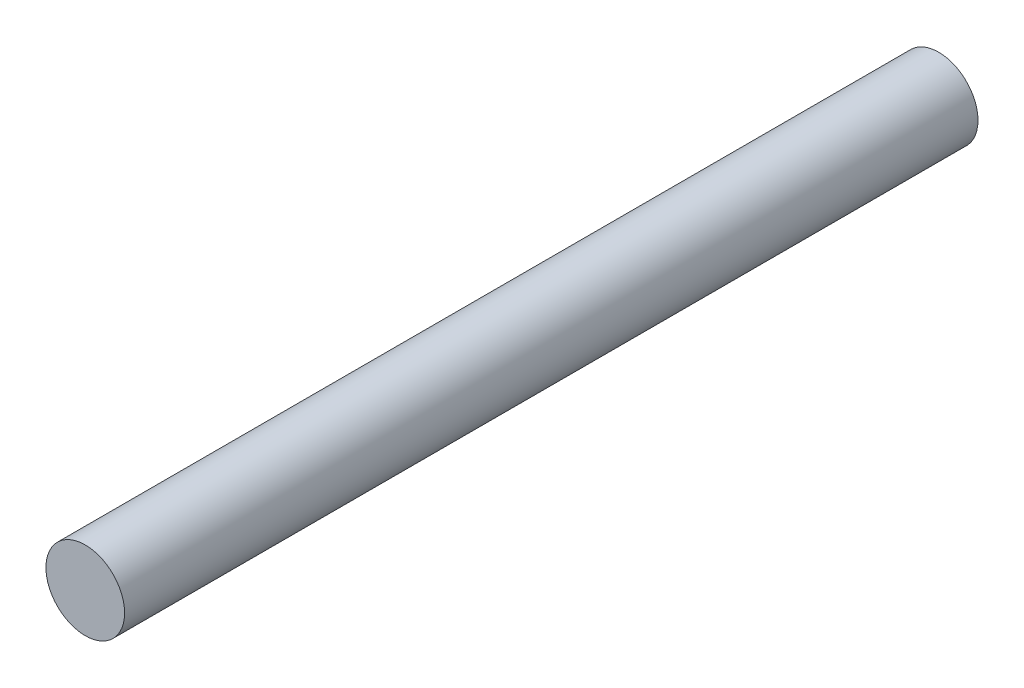
ISO-10303-21;
HEADER;
FILE_DESCRIPTION(('STEP AP214'),'2;1');
FILE_NAME('part.step','',(''),(''),'','','');
FILE_SCHEMA(('AUTOMOTIVE_DESIGN { 1 0 10303 214 1 1 1 1 }'));
ENDSEC;
DATA;
#1=APPLICATION_CONTEXT('core data for automotive mechanical design processes');
#2=APPLICATION_PROTOCOL_DEFINITION('international standard','automotive_design',2000,#1);
#3=PRODUCT_CONTEXT('',#1,'mechanical');
#4=PRODUCT('Part','Part','',(#3));
#5=PRODUCT_RELATED_PRODUCT_CATEGORY('part','',(#4));
#6=PRODUCT_DEFINITION_FORMATION('','',#4);
#7=PRODUCT_DEFINITION_CONTEXT('part definition',#1,'design');
#8=PRODUCT_DEFINITION('design','',#6,#7);
#9=PRODUCT_DEFINITION_SHAPE('','',#8);
#10=(LENGTH_UNIT() NAMED_UNIT(*) SI_UNIT(.MILLI.,.METRE.));
#11=(NAMED_UNIT(*) PLANE_ANGLE_UNIT() SI_UNIT($,.RADIAN.));
#12=(NAMED_UNIT(*) SI_UNIT($,.STERADIAN.) SOLID_ANGLE_UNIT());
#13=UNCERTAINTY_MEASURE_WITH_UNIT(LENGTH_MEASURE(1.E-05),#10,'distance_accuracy_value','');
#14=(GEOMETRIC_REPRESENTATION_CONTEXT(3) GLOBAL_UNCERTAINTY_ASSIGNED_CONTEXT((#13)) GLOBAL_UNIT_ASSIGNED_CONTEXT((#10,
#11,#12)) REPRESENTATION_CONTEXT('',''));
#15=CARTESIAN_POINT('',(0.,0.,0.));
#16=DIRECTION('',(0.,0.,1.));
#17=DIRECTION('',(1.,0.,0.));
#18=AXIS2_PLACEMENT_3D('',#15,#16,#17);
#19=CARTESIAN_POINT('',(0.,0.,54.24));
#20=DIRECTION('',(0.,0.,-1.));
#21=DIRECTION('',(-1.,0.,0.));
#22=AXIS2_PLACEMENT_3D('',#19,#20,#21);
#23=CYLINDRICAL_SURFACE('',#22,2.5);
#24=CARTESIAN_POINT('',(0.,0.,54.24));
#25=DIRECTION('',(0.,0.,1.));
#26=DIRECTION('',(1.,0.,0.));
#27=AXIS2_PLACEMENT_3D('',#24,#25,#26);
#28=CIRCLE('',#27,2.5);
#29=CARTESIAN_POINT('',(2.5,0.,54.24));
#30=VERTEX_POINT('',#29);
#31=EDGE_CURVE('E10',#30,#30,#28,.T.);
#32=ORIENTED_EDGE('',*,*,#31,.F.);
#33=EDGE_LOOP('',(#32));
#34=FACE_BOUND('',#33,.T.);
#35=CARTESIAN_POINT('',(0.,0.,0.));
#36=DIRECTION('',(0.,0.,1.));
#37=DIRECTION('',(1.,0.,0.));
#38=AXIS2_PLACEMENT_3D('',#35,#36,#37);
#39=CIRCLE('',#38,2.5);
#40=CARTESIAN_POINT('',(2.5,0.,0.));
#41=VERTEX_POINT('',#40);
#42=EDGE_CURVE('E34',#41,#41,#39,.T.);
#43=ORIENTED_EDGE('',*,*,#42,.T.);
#44=EDGE_LOOP('',(#43));
#45=FACE_BOUND('',#44,.T.);
#46=ADVANCED_FACE('F31',(#34,#45),#23,.T.);
#47=CARTESIAN_POINT('',(0.,0.,54.24));
#48=DIRECTION('',(0.,0.,1.));
#49=DIRECTION('',(1.,0.,0.));
#50=AXIS2_PLACEMENT_3D('',#47,#48,#49);
#51=PLANE('',#50);
#52=ORIENTED_EDGE('',*,*,#31,.T.);
#53=EDGE_LOOP('',(#52));
#54=FACE_BOUND('',#53,.T.);
#55=ADVANCED_FACE('F46',(#54),#51,.T.);
#56=CARTESIAN_POINT('',(0.,0.,0.));
#57=DIRECTION('',(0.,0.,1.));
#58=DIRECTION('',(1.,0.,0.));
#59=AXIS2_PLACEMENT_3D('',#56,#57,#58);
#60=PLANE('',#59);
#61=ORIENTED_EDGE('',*,*,#42,.F.);
#62=EDGE_LOOP('',(#61));
#63=FACE_BOUND('',#62,.T.);
#64=ADVANCED_FACE('F44',(#63),#60,.F.);
#65=CLOSED_SHELL('',(#46,#55,#64));
#66=MANIFOLD_SOLID_BREP('B2',#65);
#67=ADVANCED_BREP_SHAPE_REPRESENTATION('',(#18,#66),#14);
#68=SHAPE_DEFINITION_REPRESENTATION(#9,#67);
ENDSEC;
END-ISO-10303-21;
